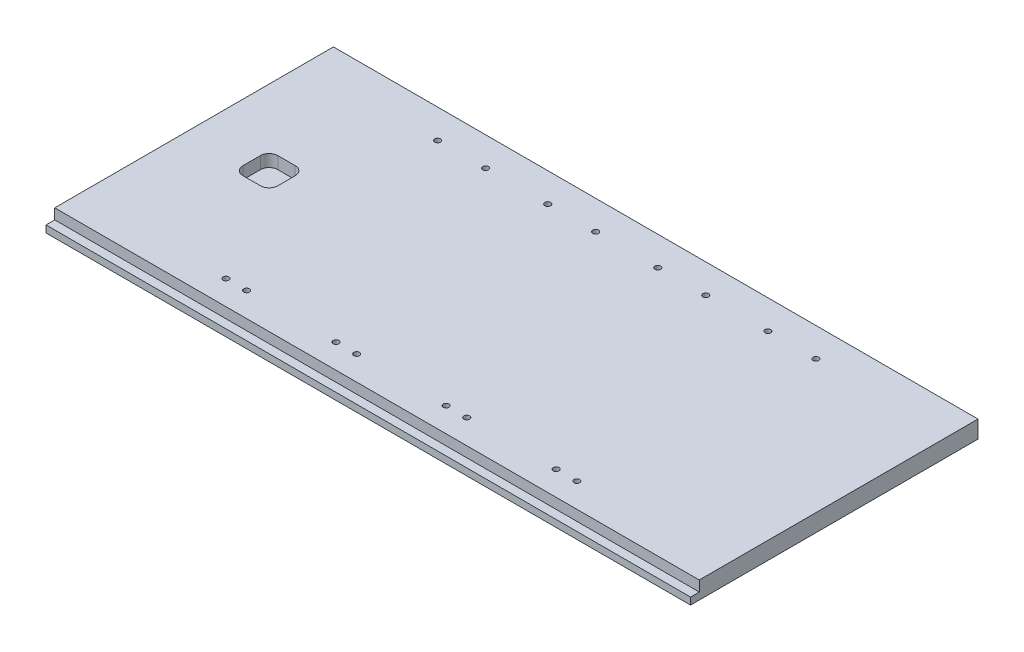
ISO-10303-21;
HEADER;
FILE_DESCRIPTION(('STEP AP214'),'2;1');
FILE_NAME('part.step','',(''),(''),'','','');
FILE_SCHEMA(('AUTOMOTIVE_DESIGN { 1 0 10303 214 1 1 1 1 }'));
ENDSEC;
DATA;
#1=APPLICATION_CONTEXT('core data for automotive mechanical design processes');
#2=APPLICATION_PROTOCOL_DEFINITION('international standard','automotive_design',2000,#1);
#3=PRODUCT_CONTEXT('',#1,'mechanical');
#4=PRODUCT('Part','Part','',(#3));
#5=PRODUCT_RELATED_PRODUCT_CATEGORY('part','',(#4));
#6=PRODUCT_DEFINITION_FORMATION('','',#4);
#7=PRODUCT_DEFINITION_CONTEXT('part definition',#1,'design');
#8=PRODUCT_DEFINITION('design','',#6,#7);
#9=PRODUCT_DEFINITION_SHAPE('','',#8);
#10=(LENGTH_UNIT() NAMED_UNIT(*) SI_UNIT(.MILLI.,.METRE.));
#11=(NAMED_UNIT(*) PLANE_ANGLE_UNIT() SI_UNIT($,.RADIAN.));
#12=(NAMED_UNIT(*) SI_UNIT($,.STERADIAN.) SOLID_ANGLE_UNIT());
#13=UNCERTAINTY_MEASURE_WITH_UNIT(LENGTH_MEASURE(1.E-05),#10,'distance_accuracy_value','');
#14=(GEOMETRIC_REPRESENTATION_CONTEXT(3) GLOBAL_UNCERTAINTY_ASSIGNED_CONTEXT((#13)) GLOBAL_UNIT_ASSIGNED_CONTEXT((#10,
#11,#12)) REPRESENTATION_CONTEXT('',''));
#15=CARTESIAN_POINT('',(0.,0.,0.));
#16=DIRECTION('',(0.,0.,1.));
#17=DIRECTION('',(1.,0.,0.));
#18=AXIS2_PLACEMENT_3D('',#15,#16,#17);
#19=CARTESIAN_POINT('',(-234.95,12.7,104.775));
#20=DIRECTION('',(1.,0.,0.));
#21=DIRECTION('',(0.,0.,-1.));
#22=AXIS2_PLACEMENT_3D('',#19,#20,#21);
#23=PLANE('',#22);
#24=DIRECTION('',(0.,-1.,0.));
#25=VECTOR('',#24,1.);
#26=CARTESIAN_POINT('',(-234.95,12.7,104.775));
#27=LINE('',#26,#25);
#28=CARTESIAN_POINT('',(-234.95,5.08,104.775));
#29=VERTEX_POINT('',#28);
#30=CARTESIAN_POINT('',(-234.95,0.,104.775));
#31=VERTEX_POINT('',#30);
#32=EDGE_CURVE('E210',#29,#31,#27,.T.);
#33=ORIENTED_EDGE('',*,*,#32,.F.);
#34=DIRECTION('',(0.,0.,1.));
#35=VECTOR('',#34,1.);
#36=CARTESIAN_POINT('',(-234.95,5.08,104.775));
#37=LINE('',#36,#35);
#38=CARTESIAN_POINT('',(-234.95,5.08,98.4250000000001));
#39=VERTEX_POINT('',#38);
#40=EDGE_CURVE('E158',#39,#29,#37,.T.);
#41=ORIENTED_EDGE('',*,*,#40,.F.);
#42=DIRECTION('',(0.,-1.,0.));
#43=VECTOR('',#42,1.);
#44=CARTESIAN_POINT('',(-234.95,12.7,98.4250000000001));
#45=LINE('',#44,#43);
#46=CARTESIAN_POINT('',(-234.95,12.7,98.4250000000001));
#47=VERTEX_POINT('',#46);
#48=EDGE_CURVE('E149',#47,#39,#45,.T.);
#49=ORIENTED_EDGE('',*,*,#48,.F.);
#50=DIRECTION('',(0.,0.,1.));
#51=VECTOR('',#50,1.);
#52=CARTESIAN_POINT('',(-234.95,12.7,104.775));
#53=LINE('',#52,#51);
#54=CARTESIAN_POINT('',(-234.95,12.7,-104.775));
#55=VERTEX_POINT('',#54);
#56=EDGE_CURVE('E164',#55,#47,#53,.T.);
#57=ORIENTED_EDGE('',*,*,#56,.F.);
#58=DIRECTION('',(0.,-1.,0.));
#59=VECTOR('',#58,1.);
#60=CARTESIAN_POINT('',(-234.95,12.7,-104.775));
#61=LINE('',#60,#59);
#62=CARTESIAN_POINT('',(-234.95,0.,-104.775));
#63=VERTEX_POINT('',#62);
#64=EDGE_CURVE('E189',#55,#63,#61,.T.);
#65=ORIENTED_EDGE('',*,*,#64,.T.);
#66=DIRECTION('',(0.,0.,1.));
#67=VECTOR('',#66,1.);
#68=CARTESIAN_POINT('',(-234.95,0.,104.775));
#69=LINE('',#68,#67);
#70=EDGE_CURVE('E190',#63,#31,#69,.T.);
#71=ORIENTED_EDGE('',*,*,#70,.T.);
#72=EDGE_LOOP('',(#33,#41,#49,#57,#65,#71));
#73=FACE_BOUND('',#72,.T.);
#74=ADVANCED_FACE('F45',(#73),#23,.F.);
#75=CARTESIAN_POINT('',(234.95,12.7,104.775));
#76=DIRECTION('',(0.,0.,-1.));
#77=DIRECTION('',(-1.,0.,0.));
#78=AXIS2_PLACEMENT_3D('',#75,#76,#77);
#79=PLANE('',#78);
#80=DIRECTION('',(0.,-1.,0.));
#81=VECTOR('',#80,1.);
#82=CARTESIAN_POINT('',(234.95,12.7,104.775));
#83=LINE('',#82,#81);
#84=CARTESIAN_POINT('',(234.95,5.08,104.775));
#85=VERTEX_POINT('',#84);
#86=CARTESIAN_POINT('',(234.95,0.,104.775));
#87=VERTEX_POINT('',#86);
#88=EDGE_CURVE('E207',#85,#87,#83,.T.);
#89=ORIENTED_EDGE('',*,*,#88,.F.);
#90=DIRECTION('',(-1.,0.,0.));
#91=VECTOR('',#90,1.);
#92=CARTESIAN_POINT('',(234.951,5.08,104.775));
#93=LINE('',#92,#91);
#94=EDGE_CURVE('E467',#85,#29,#93,.T.);
#95=ORIENTED_EDGE('',*,*,#94,.T.);
#96=ORIENTED_EDGE('',*,*,#32,.T.);
#97=DIRECTION('',(1.,0.,0.));
#98=VECTOR('',#97,1.);
#99=CARTESIAN_POINT('',(234.95,0.,104.775));
#100=LINE('',#99,#98);
#101=EDGE_CURVE('E194',#31,#87,#100,.T.);
#102=ORIENTED_EDGE('',*,*,#101,.T.);
#103=EDGE_LOOP('',(#89,#95,#96,#102));
#104=FACE_BOUND('',#103,.T.);
#105=ADVANCED_FACE('F415',(#104),#79,.F.);
#106=CARTESIAN_POINT('',(234.95,12.7,104.775));
#107=DIRECTION('',(-1.,0.,0.));
#108=DIRECTION('',(0.,0.,1.));
#109=AXIS2_PLACEMENT_3D('',#106,#107,#108);
#110=PLANE('',#109);
#111=DIRECTION('',(0.,1.,0.));
#112=VECTOR('',#111,1.);
#113=CARTESIAN_POINT('',(234.95,12.7,98.4250000000001));
#114=LINE('',#113,#112);
#115=CARTESIAN_POINT('',(234.95,5.08,98.4250000000001));
#116=VERTEX_POINT('',#115);
#117=CARTESIAN_POINT('',(234.95,12.7,98.4250000000001));
#118=VERTEX_POINT('',#117);
#119=EDGE_CURVE('E152',#116,#118,#114,.T.);
#120=ORIENTED_EDGE('',*,*,#119,.F.);
#121=DIRECTION('',(0.,0.,-1.));
#122=VECTOR('',#121,1.);
#123=CARTESIAN_POINT('',(234.95,5.08,104.775));
#124=LINE('',#123,#122);
#125=EDGE_CURVE('E166',#85,#116,#124,.T.);
#126=ORIENTED_EDGE('',*,*,#125,.F.);
#127=ORIENTED_EDGE('',*,*,#88,.T.);
#128=DIRECTION('',(0.,0.,-1.));
#129=VECTOR('',#128,1.);
#130=CARTESIAN_POINT('',(234.95,0.,104.775));
#131=LINE('',#130,#129);
#132=CARTESIAN_POINT('',(234.95,0.,-104.775));
#133=VERTEX_POINT('',#132);
#134=EDGE_CURVE('E181',#87,#133,#131,.T.);
#135=ORIENTED_EDGE('',*,*,#134,.T.);
#136=DIRECTION('',(0.,-1.,0.));
#137=VECTOR('',#136,1.);
#138=CARTESIAN_POINT('',(234.95,12.7,-104.775));
#139=LINE('',#138,#137);
#140=CARTESIAN_POINT('',(234.95,12.7,-104.775));
#141=VERTEX_POINT('',#140);
#142=EDGE_CURVE('E203',#141,#133,#139,.T.);
#143=ORIENTED_EDGE('',*,*,#142,.F.);
#144=DIRECTION('',(0.,0.,-1.));
#145=VECTOR('',#144,1.);
#146=CARTESIAN_POINT('',(234.95,12.7,104.775));
#147=LINE('',#146,#145);
#148=EDGE_CURVE('E173',#118,#141,#147,.T.);
#149=ORIENTED_EDGE('',*,*,#148,.F.);
#150=EDGE_LOOP('',(#120,#126,#127,#135,#143,#149));
#151=FACE_BOUND('',#150,.T.);
#152=ADVANCED_FACE('F419',(#151),#110,.F.);
#153=CARTESIAN_POINT('',(234.95,12.7,-104.775));
#154=DIRECTION('',(0.,0.,1.));
#155=DIRECTION('',(1.,0.,0.));
#156=AXIS2_PLACEMENT_3D('',#153,#154,#155);
#157=PLANE('',#156);
#158=DIRECTION('',(-1.,0.,0.));
#159=VECTOR('',#158,1.);
#160=CARTESIAN_POINT('',(234.95,0.,-104.775));
#161=LINE('',#160,#159);
#162=EDGE_CURVE('E174',#133,#63,#161,.T.);
#163=ORIENTED_EDGE('',*,*,#162,.T.);
#164=ORIENTED_EDGE('',*,*,#64,.F.);
#165=DIRECTION('',(-1.,0.,0.));
#166=VECTOR('',#165,1.);
#167=CARTESIAN_POINT('',(234.95,12.7,-104.775));
#168=LINE('',#167,#166);
#169=EDGE_CURVE('E170',#141,#55,#168,.T.);
#170=ORIENTED_EDGE('',*,*,#169,.F.);
#171=ORIENTED_EDGE('',*,*,#142,.T.);
#172=EDGE_LOOP('',(#163,#164,#170,#171));
#173=FACE_BOUND('',#172,.T.);
#174=ADVANCED_FACE('F388',(#173),#157,.F.);
#175=CARTESIAN_POINT('',(0.,12.7,0.));
#176=DIRECTION('',(0.,1.,0.));
#177=DIRECTION('',(0.,0.,1.));
#178=AXIS2_PLACEMENT_3D('',#175,#176,#177);
#179=PLANE('',#178);
#180=DIRECTION('',(-1.,0.,0.));
#181=VECTOR('',#180,1.);
#182=CARTESIAN_POINT('',(234.951,12.7,98.4250000000001));
#183=LINE('',#182,#181);
#184=EDGE_CURVE('E146',#118,#47,#183,.T.);
#185=ORIENTED_EDGE('',*,*,#184,.F.);
#186=ORIENTED_EDGE('',*,*,#148,.T.);
#187=ORIENTED_EDGE('',*,*,#169,.T.);
#188=ORIENTED_EDGE('',*,*,#56,.T.);
#189=EDGE_LOOP('',(#185,#186,#187,#188));
#190=FACE_BOUND('',#189,.T.);
#191=DIRECTION('',(0.,0.,-1.));
#192=VECTOR('',#191,1.);
#193=CARTESIAN_POINT('',(-167.55,12.7,-15.8749999999999));
#194=LINE('',#193,#192);
#195=CARTESIAN_POINT('',(-167.55,12.7,3.17500000000006));
#196=VERTEX_POINT('',#195);
#197=CARTESIAN_POINT('',(-167.55,12.7,-9.52499999999994));
#198=VERTEX_POINT('',#197);
#199=EDGE_CURVE('E462',#196,#198,#194,.T.);
#200=ORIENTED_EDGE('',*,*,#199,.F.);
#201=CARTESIAN_POINT('',(-173.9,12.7,3.17500000000006));
#202=DIRECTION('',(0.,1.,0.));
#203=DIRECTION('',(0.,0.,1.));
#204=AXIS2_PLACEMENT_3D('',#201,#202,#203);
#205=CIRCLE('',#204,6.35);
#206=CARTESIAN_POINT('',(-173.9,12.7,9.52500000000006));
#207=VERTEX_POINT('',#206);
#208=EDGE_CURVE('E252',#196,#207,#205,.F.);
#209=ORIENTED_EDGE('',*,*,#208,.T.);
#210=DIRECTION('',(1.,0.,0.));
#211=VECTOR('',#210,1.);
#212=CARTESIAN_POINT('',(-192.95,12.7,9.52500000000006));
#213=LINE('',#212,#211);
#214=CARTESIAN_POINT('',(-186.6,12.7,9.52500000000006));
#215=VERTEX_POINT('',#214);
#216=EDGE_CURVE('E473',#215,#207,#213,.T.);
#217=ORIENTED_EDGE('',*,*,#216,.F.);
#218=CARTESIAN_POINT('',(-186.6,12.7,3.17500000000006));
#219=DIRECTION('',(0.,1.,0.));
#220=DIRECTION('',(0.,0.,1.));
#221=AXIS2_PLACEMENT_3D('',#218,#219,#220);
#222=CIRCLE('',#221,6.35);
#223=CARTESIAN_POINT('',(-192.95,12.7,3.17500000000006));
#224=VERTEX_POINT('',#223);
#225=EDGE_CURVE('E255',#215,#224,#222,.F.);
#226=ORIENTED_EDGE('',*,*,#225,.T.);
#227=DIRECTION('',(0.,0.,1.));
#228=VECTOR('',#227,1.);
#229=CARTESIAN_POINT('',(-192.95,12.7,-15.8749999999999));
#230=LINE('',#229,#228);
#231=CARTESIAN_POINT('',(-192.95,12.7,-9.52499999999994));
#232=VERTEX_POINT('',#231);
#233=EDGE_CURVE('E470',#232,#224,#230,.T.);
#234=ORIENTED_EDGE('',*,*,#233,.F.);
#235=CARTESIAN_POINT('',(-186.6,12.7,-9.52499999999994));
#236=DIRECTION('',(0.,1.,0.));
#237=DIRECTION('',(0.,0.,1.));
#238=AXIS2_PLACEMENT_3D('',#235,#236,#237);
#239=CIRCLE('',#238,6.35);
#240=CARTESIAN_POINT('',(-186.6,12.7,-15.8749999999999));
#241=VERTEX_POINT('',#240);
#242=EDGE_CURVE('E54',#232,#241,#239,.F.);
#243=ORIENTED_EDGE('',*,*,#242,.T.);
#244=DIRECTION('',(-1.,0.,0.));
#245=VECTOR('',#244,1.);
#246=CARTESIAN_POINT('',(-192.95,12.7,-15.8749999999999));
#247=LINE('',#246,#245);
#248=CARTESIAN_POINT('',(-173.9,12.7,-15.8749999999999));
#249=VERTEX_POINT('',#248);
#250=EDGE_CURVE('E466',#249,#241,#247,.T.);
#251=ORIENTED_EDGE('',*,*,#250,.F.);
#252=CARTESIAN_POINT('',(-173.9,12.7,-9.52499999999994));
#253=DIRECTION('',(0.,1.,0.));
#254=DIRECTION('',(0.,0.,1.));
#255=AXIS2_PLACEMENT_3D('',#252,#253,#254);
#256=CIRCLE('',#255,6.35);
#257=EDGE_CURVE('E11',#249,#198,#256,.F.);
#258=ORIENTED_EDGE('',*,*,#257,.T.);
#259=EDGE_LOOP('',(#200,#209,#217,#226,#234,#243,#251,#258));
#260=FACE_BOUND('',#259,.T.);
#261=CARTESIAN_POINT('',(-137.85,12.7,-83.65));
#262=DIRECTION('',(0.,1.,0.));
#263=DIRECTION('',(0.,0.,1.));
#264=AXIS2_PLACEMENT_3D('',#261,#262,#263);
#265=CIRCLE('',#264,2.09999999999999);
#266=CARTESIAN_POINT('',(-137.85,12.7,-81.55));
#267=VERTEX_POINT('',#266);
#268=EDGE_CURVE('E290',#267,#267,#265,.T.);
#269=ORIENTED_EDGE('',*,*,#268,.F.);
#270=EDGE_LOOP('',(#269));
#271=FACE_BOUND('',#270,.T.);
#272=CARTESIAN_POINT('',(127.9,12.7,80.65));
#273=DIRECTION('',(0.,1.,0.));
#274=DIRECTION('',(0.,0.,1.));
#275=AXIS2_PLACEMENT_3D('',#272,#273,#274);
#276=CIRCLE('',#275,2.09999999999999);
#277=CARTESIAN_POINT('',(127.9,12.7,82.75));
#278=VERTEX_POINT('',#277);
#279=EDGE_CURVE('E486',#278,#278,#276,.T.);
#280=ORIENTED_EDGE('',*,*,#279,.F.);
#281=EDGE_LOOP('',(#280));
#282=FACE_BOUND('',#281,.T.);
#283=CARTESIAN_POINT('',(47.65,12.7,80.65));
#284=DIRECTION('',(0.,1.,0.));
#285=DIRECTION('',(0.,0.,1.));
#286=AXIS2_PLACEMENT_3D('',#283,#284,#285);
#287=CIRCLE('',#286,2.1);
#288=CARTESIAN_POINT('',(47.65,12.7,82.75));
#289=VERTEX_POINT('',#288);
#290=EDGE_CURVE('E304',#289,#289,#287,.T.);
#291=ORIENTED_EDGE('',*,*,#290,.F.);
#292=EDGE_LOOP('',(#291));
#293=FACE_BOUND('',#292,.T.);
#294=CARTESIAN_POINT('',(-32.6,12.7,80.65));
#295=DIRECTION('',(0.,1.,0.));
#296=DIRECTION('',(0.,0.,1.));
#297=AXIS2_PLACEMENT_3D('',#294,#295,#296);
#298=CIRCLE('',#297,2.1);
#299=CARTESIAN_POINT('',(-32.6,12.7,82.75));
#300=VERTEX_POINT('',#299);
#301=EDGE_CURVE('E273',#300,#300,#298,.T.);
#302=ORIENTED_EDGE('',*,*,#301,.F.);
#303=EDGE_LOOP('',(#302));
#304=FACE_BOUND('',#303,.T.);
#305=CARTESIAN_POINT('',(-57.6,12.7,-83.65));
#306=DIRECTION('',(0.,1.,0.));
#307=DIRECTION('',(0.,0.,1.));
#308=AXIS2_PLACEMENT_3D('',#305,#306,#307);
#309=CIRCLE('',#308,2.1);
#310=CARTESIAN_POINT('',(-57.6,12.7,-81.55));
#311=VERTEX_POINT('',#310);
#312=EDGE_CURVE('E293',#311,#311,#309,.T.);
#313=ORIENTED_EDGE('',*,*,#312,.F.);
#314=EDGE_LOOP('',(#313));
#315=FACE_BOUND('',#314,.T.);
#316=CARTESIAN_POINT('',(22.65,12.7,-83.65));
#317=DIRECTION('',(0.,1.,0.));
#318=DIRECTION('',(0.,0.,1.));
#319=AXIS2_PLACEMENT_3D('',#316,#317,#318);
#320=CIRCLE('',#319,2.1);
#321=CARTESIAN_POINT('',(22.65,12.7,-81.55));
#322=VERTEX_POINT('',#321);
#323=EDGE_CURVE('E287',#322,#322,#320,.T.);
#324=ORIENTED_EDGE('',*,*,#323,.F.);
#325=EDGE_LOOP('',(#324));
#326=FACE_BOUND('',#325,.T.);
#327=CARTESIAN_POINT('',(102.9,12.7,-83.65));
#328=DIRECTION('',(0.,1.,0.));
#329=DIRECTION('',(0.,0.,1.));
#330=AXIS2_PLACEMENT_3D('',#327,#328,#329);
#331=CIRCLE('',#330,2.1);
#332=CARTESIAN_POINT('',(102.9,12.7,-81.55));
#333=VERTEX_POINT('',#332);
#334=EDGE_CURVE('E288',#333,#333,#331,.T.);
#335=ORIENTED_EDGE('',*,*,#334,.F.);
#336=EDGE_LOOP('',(#335));
#337=FACE_BOUND('',#336,.T.);
#338=CARTESIAN_POINT('',(-112.85,12.7,80.65));
#339=DIRECTION('',(0.,1.,0.));
#340=DIRECTION('',(0.,0.,1.));
#341=AXIS2_PLACEMENT_3D('',#338,#339,#340);
#342=CIRCLE('',#341,2.1);
#343=CARTESIAN_POINT('',(-112.85,12.7,82.75));
#344=VERTEX_POINT('',#343);
#345=EDGE_CURVE('E312',#344,#344,#342,.T.);
#346=ORIENTED_EDGE('',*,*,#345,.F.);
#347=EDGE_LOOP('',(#346));
#348=FACE_BOUND('',#347,.T.);
#349=CARTESIAN_POINT('',(-127.9,12.7,80.65));
#350=DIRECTION('',(0.,1.,0.));
#351=DIRECTION('',(0.,0.,1.));
#352=AXIS2_PLACEMENT_3D('',#349,#350,#351);
#353=CIRCLE('',#352,2.09999999999999);
#354=CARTESIAN_POINT('',(-127.9,12.7,82.75));
#355=VERTEX_POINT('',#354);
#356=EDGE_CURVE('E300',#355,#355,#353,.T.);
#357=ORIENTED_EDGE('',*,*,#356,.F.);
#358=EDGE_LOOP('',(#357));
#359=FACE_BOUND('',#358,.T.);
#360=CARTESIAN_POINT('',(137.85,12.7,-83.65));
#361=DIRECTION('',(0.,1.,0.));
#362=DIRECTION('',(0.,0.,1.));
#363=AXIS2_PLACEMENT_3D('',#360,#361,#362);
#364=CIRCLE('',#363,2.09999999999999);
#365=CARTESIAN_POINT('',(137.85,12.7,-81.55));
#366=VERTEX_POINT('',#365);
#367=EDGE_CURVE('E299',#366,#366,#364,.T.);
#368=ORIENTED_EDGE('',*,*,#367,.F.);
#369=EDGE_LOOP('',(#368));
#370=FACE_BOUND('',#369,.T.);
#371=CARTESIAN_POINT('',(57.6,12.7,-83.65));
#372=DIRECTION('',(0.,1.,0.));
#373=DIRECTION('',(0.,0.,1.));
#374=AXIS2_PLACEMENT_3D('',#371,#372,#373);
#375=CIRCLE('',#374,2.1);
#376=CARTESIAN_POINT('',(57.6,12.7,-81.55));
#377=VERTEX_POINT('',#376);
#378=EDGE_CURVE('E366',#377,#377,#375,.T.);
#379=ORIENTED_EDGE('',*,*,#378,.F.);
#380=EDGE_LOOP('',(#379));
#381=FACE_BOUND('',#380,.T.);
#382=CARTESIAN_POINT('',(-22.65,12.7,-83.65));
#383=DIRECTION('',(0.,1.,0.));
#384=DIRECTION('',(0.,0.,1.));
#385=AXIS2_PLACEMENT_3D('',#382,#383,#384);
#386=CIRCLE('',#385,2.1);
#387=CARTESIAN_POINT('',(-22.65,12.7,-81.55));
#388=VERTEX_POINT('',#387);
#389=EDGE_CURVE('E268',#388,#388,#386,.T.);
#390=ORIENTED_EDGE('',*,*,#389,.F.);
#391=EDGE_LOOP('',(#390));
#392=FACE_BOUND('',#391,.T.);
#393=CARTESIAN_POINT('',(-47.65,12.7,80.65));
#394=DIRECTION('',(0.,1.,0.));
#395=DIRECTION('',(0.,0.,1.));
#396=AXIS2_PLACEMENT_3D('',#393,#394,#395);
#397=CIRCLE('',#396,2.1);
#398=CARTESIAN_POINT('',(-47.65,12.7,82.75));
#399=VERTEX_POINT('',#398);
#400=EDGE_CURVE('E334',#399,#399,#397,.T.);
#401=ORIENTED_EDGE('',*,*,#400,.F.);
#402=EDGE_LOOP('',(#401));
#403=FACE_BOUND('',#402,.T.);
#404=CARTESIAN_POINT('',(32.6,12.7,80.65));
#405=DIRECTION('',(0.,1.,0.));
#406=DIRECTION('',(0.,0.,1.));
#407=AXIS2_PLACEMENT_3D('',#404,#405,#406);
#408=CIRCLE('',#407,2.1);
#409=CARTESIAN_POINT('',(32.6,12.7,82.75));
#410=VERTEX_POINT('',#409);
#411=EDGE_CURVE('E265',#410,#410,#408,.T.);
#412=ORIENTED_EDGE('',*,*,#411,.F.);
#413=EDGE_LOOP('',(#412));
#414=FACE_BOUND('',#413,.T.);
#415=CARTESIAN_POINT('',(112.85,12.7,80.65));
#416=DIRECTION('',(0.,1.,0.));
#417=DIRECTION('',(0.,0.,1.));
#418=AXIS2_PLACEMENT_3D('',#415,#416,#417);
#419=CIRCLE('',#418,2.1);
#420=CARTESIAN_POINT('',(112.85,12.7,82.75));
#421=VERTEX_POINT('',#420);
#422=EDGE_CURVE('E266',#421,#421,#419,.T.);
#423=ORIENTED_EDGE('',*,*,#422,.F.);
#424=EDGE_LOOP('',(#423));
#425=FACE_BOUND('',#424,.T.);
#426=CARTESIAN_POINT('',(-102.9,12.7,-83.65));
#427=DIRECTION('',(0.,1.,0.));
#428=DIRECTION('',(0.,0.,1.));
#429=AXIS2_PLACEMENT_3D('',#426,#427,#428);
#430=CIRCLE('',#429,2.1);
#431=CARTESIAN_POINT('',(-102.9,12.7,-81.55));
#432=VERTEX_POINT('',#431);
#433=EDGE_CURVE('E184',#432,#432,#430,.T.);
#434=ORIENTED_EDGE('',*,*,#433,.F.);
#435=EDGE_LOOP('',(#434));
#436=FACE_BOUND('',#435,.T.);
#437=ADVANCED_FACE('F168',(#190,#260,#271,#282,#293,#304,#315,#326,#337,#348,#359,#370,#381,
#392,#403,#414,#425,#436),#179,.T.);
#438=CARTESIAN_POINT('',(0.,0.,0.));
#439=DIRECTION('',(0.,1.,0.));
#440=DIRECTION('',(0.,0.,1.));
#441=AXIS2_PLACEMENT_3D('',#438,#439,#440);
#442=PLANE('',#441);
#443=CARTESIAN_POINT('',(-137.85,0.,-83.65));
#444=DIRECTION('',(0.,1.,0.));
#445=DIRECTION('',(0.,0.,1.));
#446=AXIS2_PLACEMENT_3D('',#443,#444,#445);
#447=CIRCLE('',#446,2.09999999999999);
#448=CARTESIAN_POINT('',(-137.85,0.,-81.55));
#449=VERTEX_POINT('',#448);
#450=EDGE_CURVE('E292',#449,#449,#447,.T.);
#451=ORIENTED_EDGE('',*,*,#450,.T.);
#452=EDGE_LOOP('',(#451));
#453=FACE_BOUND('',#452,.T.);
#454=CARTESIAN_POINT('',(127.9,0.,80.65));
#455=DIRECTION('',(0.,1.,0.));
#456=DIRECTION('',(0.,0.,1.));
#457=AXIS2_PLACEMENT_3D('',#454,#455,#456);
#458=CIRCLE('',#457,2.09999999999999);
#459=CARTESIAN_POINT('',(127.9,0.,82.75));
#460=VERTEX_POINT('',#459);
#461=EDGE_CURVE('E315',#460,#460,#458,.T.);
#462=ORIENTED_EDGE('',*,*,#461,.T.);
#463=EDGE_LOOP('',(#462));
#464=FACE_BOUND('',#463,.T.);
#465=CARTESIAN_POINT('',(47.65,0.,80.65));
#466=DIRECTION('',(0.,1.,0.));
#467=DIRECTION('',(0.,0.,1.));
#468=AXIS2_PLACEMENT_3D('',#465,#466,#467);
#469=CIRCLE('',#468,2.1);
#470=CARTESIAN_POINT('',(47.65,0.,82.75));
#471=VERTEX_POINT('',#470);
#472=EDGE_CURVE('E483',#471,#471,#469,.T.);
#473=ORIENTED_EDGE('',*,*,#472,.T.);
#474=EDGE_LOOP('',(#473));
#475=FACE_BOUND('',#474,.T.);
#476=CARTESIAN_POINT('',(-32.6,0.,80.65));
#477=DIRECTION('',(0.,1.,0.));
#478=DIRECTION('',(0.,0.,1.));
#479=AXIS2_PLACEMENT_3D('',#476,#477,#478);
#480=CIRCLE('',#479,2.1);
#481=CARTESIAN_POINT('',(-32.6,0.,82.75));
#482=VERTEX_POINT('',#481);
#483=EDGE_CURVE('E276',#482,#482,#480,.T.);
#484=ORIENTED_EDGE('',*,*,#483,.T.);
#485=EDGE_LOOP('',(#484));
#486=FACE_BOUND('',#485,.T.);
#487=CARTESIAN_POINT('',(-57.6,0.,-83.65));
#488=DIRECTION('',(0.,1.,0.));
#489=DIRECTION('',(0.,0.,1.));
#490=AXIS2_PLACEMENT_3D('',#487,#488,#489);
#491=CIRCLE('',#490,2.1);
#492=CARTESIAN_POINT('',(-57.6,0.,-81.55));
#493=VERTEX_POINT('',#492);
#494=EDGE_CURVE('E327',#493,#493,#491,.T.);
#495=ORIENTED_EDGE('',*,*,#494,.T.);
#496=EDGE_LOOP('',(#495));
#497=FACE_BOUND('',#496,.T.);
#498=CARTESIAN_POINT('',(22.65,0.,-83.65));
#499=DIRECTION('',(0.,1.,0.));
#500=DIRECTION('',(0.,0.,1.));
#501=AXIS2_PLACEMENT_3D('',#498,#499,#500);
#502=CIRCLE('',#501,2.1);
#503=CARTESIAN_POINT('',(22.65,0.,-81.55));
#504=VERTEX_POINT('',#503);
#505=EDGE_CURVE('E284',#504,#504,#502,.T.);
#506=ORIENTED_EDGE('',*,*,#505,.T.);
#507=EDGE_LOOP('',(#506));
#508=FACE_BOUND('',#507,.T.);
#509=CARTESIAN_POINT('',(102.9,0.,-83.65));
#510=DIRECTION('',(0.,1.,0.));
#511=DIRECTION('',(0.,0.,1.));
#512=AXIS2_PLACEMENT_3D('',#509,#510,#511);
#513=CIRCLE('',#512,2.1);
#514=CARTESIAN_POINT('',(102.9,0.,-81.55));
#515=VERTEX_POINT('',#514);
#516=EDGE_CURVE('E260',#515,#515,#513,.T.);
#517=ORIENTED_EDGE('',*,*,#516,.T.);
#518=EDGE_LOOP('',(#517));
#519=FACE_BOUND('',#518,.T.);
#520=CARTESIAN_POINT('',(-112.85,0.,80.65));
#521=DIRECTION('',(0.,1.,0.));
#522=DIRECTION('',(0.,0.,1.));
#523=AXIS2_PLACEMENT_3D('',#520,#521,#522);
#524=CIRCLE('',#523,2.1);
#525=CARTESIAN_POINT('',(-112.85,0.,82.75));
#526=VERTEX_POINT('',#525);
#527=EDGE_CURVE('E275',#526,#526,#524,.T.);
#528=ORIENTED_EDGE('',*,*,#527,.T.);
#529=EDGE_LOOP('',(#528));
#530=FACE_BOUND('',#529,.T.);
#531=CARTESIAN_POINT('',(-127.9,0.,80.65));
#532=DIRECTION('',(0.,1.,0.));
#533=DIRECTION('',(0.,0.,1.));
#534=AXIS2_PLACEMENT_3D('',#531,#532,#533);
#535=CIRCLE('',#534,2.09999999999999);
#536=CARTESIAN_POINT('',(-127.9,0.,82.75));
#537=VERTEX_POINT('',#536);
#538=EDGE_CURVE('E338',#537,#537,#535,.T.);
#539=ORIENTED_EDGE('',*,*,#538,.T.);
#540=EDGE_LOOP('',(#539));
#541=FACE_BOUND('',#540,.T.);
#542=CARTESIAN_POINT('',(137.85,0.,-83.65));
#543=DIRECTION('',(0.,1.,0.));
#544=DIRECTION('',(0.,0.,1.));
#545=AXIS2_PLACEMENT_3D('',#542,#543,#544);
#546=CIRCLE('',#545,2.09999999999999);
#547=CARTESIAN_POINT('',(137.85,0.,-81.55));
#548=VERTEX_POINT('',#547);
#549=EDGE_CURVE('E296',#548,#548,#546,.T.);
#550=ORIENTED_EDGE('',*,*,#549,.T.);
#551=EDGE_LOOP('',(#550));
#552=FACE_BOUND('',#551,.T.);
#553=CARTESIAN_POINT('',(57.6,0.,-83.65));
#554=DIRECTION('',(0.,1.,0.));
#555=DIRECTION('',(0.,0.,1.));
#556=AXIS2_PLACEMENT_3D('',#553,#554,#555);
#557=CIRCLE('',#556,2.1);
#558=CARTESIAN_POINT('',(57.6,0.,-81.55));
#559=VERTEX_POINT('',#558);
#560=EDGE_CURVE('E355',#559,#559,#557,.T.);
#561=ORIENTED_EDGE('',*,*,#560,.T.);
#562=EDGE_LOOP('',(#561));
#563=FACE_BOUND('',#562,.T.);
#564=CARTESIAN_POINT('',(-22.65,0.,-83.65));
#565=DIRECTION('',(0.,1.,0.));
#566=DIRECTION('',(0.,0.,1.));
#567=AXIS2_PLACEMENT_3D('',#564,#565,#566);
#568=CIRCLE('',#567,2.1);
#569=CARTESIAN_POINT('',(-22.65,0.,-81.55));
#570=VERTEX_POINT('',#569);
#571=EDGE_CURVE('E271',#570,#570,#568,.T.);
#572=ORIENTED_EDGE('',*,*,#571,.T.);
#573=EDGE_LOOP('',(#572));
#574=FACE_BOUND('',#573,.T.);
#575=CARTESIAN_POINT('',(-47.65,0.,80.65));
#576=DIRECTION('',(0.,1.,0.));
#577=DIRECTION('',(0.,0.,1.));
#578=AXIS2_PLACEMENT_3D('',#575,#576,#577);
#579=CIRCLE('',#578,2.1);
#580=CARTESIAN_POINT('',(-47.65,0.,82.75));
#581=VERTEX_POINT('',#580);
#582=EDGE_CURVE('E339',#581,#581,#579,.T.);
#583=ORIENTED_EDGE('',*,*,#582,.T.);
#584=EDGE_LOOP('',(#583));
#585=FACE_BOUND('',#584,.T.);
#586=CARTESIAN_POINT('',(32.6,0.,80.65));
#587=DIRECTION('',(0.,1.,0.));
#588=DIRECTION('',(0.,0.,1.));
#589=AXIS2_PLACEMENT_3D('',#586,#587,#588);
#590=CIRCLE('',#589,2.1);
#591=CARTESIAN_POINT('',(32.6,0.,82.75));
#592=VERTEX_POINT('',#591);
#593=EDGE_CURVE('E262',#592,#592,#590,.T.);
#594=ORIENTED_EDGE('',*,*,#593,.T.);
#595=EDGE_LOOP('',(#594));
#596=FACE_BOUND('',#595,.T.);
#597=CARTESIAN_POINT('',(112.85,0.,80.65));
#598=DIRECTION('',(0.,1.,0.));
#599=DIRECTION('',(0.,0.,1.));
#600=AXIS2_PLACEMENT_3D('',#597,#598,#599);
#601=CIRCLE('',#600,2.1);
#602=CARTESIAN_POINT('',(112.85,0.,82.75));
#603=VERTEX_POINT('',#602);
#604=EDGE_CURVE('E349',#603,#603,#601,.T.);
#605=ORIENTED_EDGE('',*,*,#604,.T.);
#606=EDGE_LOOP('',(#605));
#607=FACE_BOUND('',#606,.T.);
#608=CARTESIAN_POINT('',(-102.9,0.,-83.65));
#609=DIRECTION('',(0.,1.,0.));
#610=DIRECTION('',(0.,0.,1.));
#611=AXIS2_PLACEMENT_3D('',#608,#609,#610);
#612=CIRCLE('',#611,2.1);
#613=CARTESIAN_POINT('',(-102.9,0.,-81.55));
#614=VERTEX_POINT('',#613);
#615=EDGE_CURVE('E195',#614,#614,#612,.T.);
#616=ORIENTED_EDGE('',*,*,#615,.T.);
#617=EDGE_LOOP('',(#616));
#618=FACE_BOUND('',#617,.T.);
#619=ORIENTED_EDGE('',*,*,#70,.F.);
#620=ORIENTED_EDGE('',*,*,#162,.F.);
#621=ORIENTED_EDGE('',*,*,#134,.F.);
#622=ORIENTED_EDGE('',*,*,#101,.F.);
#623=EDGE_LOOP('',(#619,#620,#621,#622));
#624=FACE_BOUND('',#623,.T.);
#625=ADVANCED_FACE('F375',(#453,#464,#475,#486,#497,#508,#519,#530,#541,#552,#563,#574,#585,
#596,#607,#618,#624),#442,.F.);
#626=CARTESIAN_POINT('',(-102.9,0.,-83.65));
#627=DIRECTION('',(0.,1.,0.));
#628=DIRECTION('',(0.,0.,1.));
#629=AXIS2_PLACEMENT_3D('',#626,#627,#628);
#630=CYLINDRICAL_SURFACE('',#629,2.1);
#631=ORIENTED_EDGE('',*,*,#615,.F.);
#632=EDGE_LOOP('',(#631));
#633=FACE_BOUND('',#632,.T.);
#634=ORIENTED_EDGE('',*,*,#433,.T.);
#635=EDGE_LOOP('',(#634));
#636=FACE_BOUND('',#635,.T.);
#637=ADVANCED_FACE('F400',(#633,#636),#630,.F.);
#638=CARTESIAN_POINT('',(112.85,0.,80.65));
#639=DIRECTION('',(0.,1.,0.));
#640=DIRECTION('',(0.,0.,1.));
#641=AXIS2_PLACEMENT_3D('',#638,#639,#640);
#642=CYLINDRICAL_SURFACE('',#641,2.1);
#643=ORIENTED_EDGE('',*,*,#604,.F.);
#644=EDGE_LOOP('',(#643));
#645=FACE_BOUND('',#644,.T.);
#646=ORIENTED_EDGE('',*,*,#422,.T.);
#647=EDGE_LOOP('',(#646));
#648=FACE_BOUND('',#647,.T.);
#649=ADVANCED_FACE('F402',(#645,#648),#642,.F.);
#650=CARTESIAN_POINT('',(32.6,0.,80.65));
#651=DIRECTION('',(0.,1.,0.));
#652=DIRECTION('',(0.,0.,1.));
#653=AXIS2_PLACEMENT_3D('',#650,#651,#652);
#654=CYLINDRICAL_SURFACE('',#653,2.1);
#655=ORIENTED_EDGE('',*,*,#593,.F.);
#656=EDGE_LOOP('',(#655));
#657=FACE_BOUND('',#656,.T.);
#658=ORIENTED_EDGE('',*,*,#411,.T.);
#659=EDGE_LOOP('',(#658));
#660=FACE_BOUND('',#659,.T.);
#661=ADVANCED_FACE('F408',(#657,#660),#654,.F.);
#662=CARTESIAN_POINT('',(-47.65,0.,80.65));
#663=DIRECTION('',(0.,1.,0.));
#664=DIRECTION('',(0.,0.,1.));
#665=AXIS2_PLACEMENT_3D('',#662,#663,#664);
#666=CYLINDRICAL_SURFACE('',#665,2.1);
#667=ORIENTED_EDGE('',*,*,#582,.F.);
#668=EDGE_LOOP('',(#667));
#669=FACE_BOUND('',#668,.T.);
#670=ORIENTED_EDGE('',*,*,#400,.T.);
#671=EDGE_LOOP('',(#670));
#672=FACE_BOUND('',#671,.T.);
#673=ADVANCED_FACE('F530',(#669,#672),#666,.F.);
#674=CARTESIAN_POINT('',(-22.65,0.,-83.65));
#675=DIRECTION('',(0.,1.,0.));
#676=DIRECTION('',(0.,0.,1.));
#677=AXIS2_PLACEMENT_3D('',#674,#675,#676);
#678=CYLINDRICAL_SURFACE('',#677,2.1);
#679=ORIENTED_EDGE('',*,*,#571,.F.);
#680=EDGE_LOOP('',(#679));
#681=FACE_BOUND('',#680,.T.);
#682=ORIENTED_EDGE('',*,*,#389,.T.);
#683=EDGE_LOOP('',(#682));
#684=FACE_BOUND('',#683,.T.);
#685=ADVANCED_FACE('F382',(#681,#684),#678,.F.);
#686=CARTESIAN_POINT('',(57.6,0.,-83.65));
#687=DIRECTION('',(0.,1.,0.));
#688=DIRECTION('',(0.,0.,1.));
#689=AXIS2_PLACEMENT_3D('',#686,#687,#688);
#690=CYLINDRICAL_SURFACE('',#689,2.1);
#691=ORIENTED_EDGE('',*,*,#560,.F.);
#692=EDGE_LOOP('',(#691));
#693=FACE_BOUND('',#692,.T.);
#694=ORIENTED_EDGE('',*,*,#378,.T.);
#695=EDGE_LOOP('',(#694));
#696=FACE_BOUND('',#695,.T.);
#697=ADVANCED_FACE('F378',(#693,#696),#690,.F.);
#698=CARTESIAN_POINT('',(137.85,0.,-83.65));
#699=DIRECTION('',(0.,1.,0.));
#700=DIRECTION('',(0.,0.,1.));
#701=AXIS2_PLACEMENT_3D('',#698,#699,#700);
#702=CYLINDRICAL_SURFACE('',#701,2.09999999999999);
#703=ORIENTED_EDGE('',*,*,#549,.F.);
#704=EDGE_LOOP('',(#703));
#705=FACE_BOUND('',#704,.T.);
#706=ORIENTED_EDGE('',*,*,#367,.T.);
#707=EDGE_LOOP('',(#706));
#708=FACE_BOUND('',#707,.T.);
#709=ADVANCED_FACE('F381',(#705,#708),#702,.F.);
#710=CARTESIAN_POINT('',(-127.9,0.,80.65));
#711=DIRECTION('',(0.,1.,0.));
#712=DIRECTION('',(0.,0.,1.));
#713=AXIS2_PLACEMENT_3D('',#710,#711,#712);
#714=CYLINDRICAL_SURFACE('',#713,2.09999999999999);
#715=ORIENTED_EDGE('',*,*,#538,.F.);
#716=EDGE_LOOP('',(#715));
#717=FACE_BOUND('',#716,.T.);
#718=ORIENTED_EDGE('',*,*,#356,.T.);
#719=EDGE_LOOP('',(#718));
#720=FACE_BOUND('',#719,.T.);
#721=ADVANCED_FACE('F521',(#717,#720),#714,.F.);
#722=CARTESIAN_POINT('',(-112.85,0.,80.65));
#723=DIRECTION('',(0.,1.,0.));
#724=DIRECTION('',(0.,0.,1.));
#725=AXIS2_PLACEMENT_3D('',#722,#723,#724);
#726=CYLINDRICAL_SURFACE('',#725,2.1);
#727=ORIENTED_EDGE('',*,*,#527,.F.);
#728=EDGE_LOOP('',(#727));
#729=FACE_BOUND('',#728,.T.);
#730=ORIENTED_EDGE('',*,*,#345,.T.);
#731=EDGE_LOOP('',(#730));
#732=FACE_BOUND('',#731,.T.);
#733=ADVANCED_FACE('F517',(#729,#732),#726,.F.);
#734=CARTESIAN_POINT('',(102.9,0.,-83.65));
#735=DIRECTION('',(0.,1.,0.));
#736=DIRECTION('',(0.,0.,1.));
#737=AXIS2_PLACEMENT_3D('',#734,#735,#736);
#738=CYLINDRICAL_SURFACE('',#737,2.1);
#739=ORIENTED_EDGE('',*,*,#516,.F.);
#740=EDGE_LOOP('',(#739));
#741=FACE_BOUND('',#740,.T.);
#742=ORIENTED_EDGE('',*,*,#334,.T.);
#743=EDGE_LOOP('',(#742));
#744=FACE_BOUND('',#743,.T.);
#745=ADVANCED_FACE('F513',(#741,#744),#738,.F.);
#746=CARTESIAN_POINT('',(22.65,0.,-83.65));
#747=DIRECTION('',(0.,1.,0.));
#748=DIRECTION('',(0.,0.,1.));
#749=AXIS2_PLACEMENT_3D('',#746,#747,#748);
#750=CYLINDRICAL_SURFACE('',#749,2.1);
#751=ORIENTED_EDGE('',*,*,#505,.F.);
#752=EDGE_LOOP('',(#751));
#753=FACE_BOUND('',#752,.T.);
#754=ORIENTED_EDGE('',*,*,#323,.T.);
#755=EDGE_LOOP('',(#754));
#756=FACE_BOUND('',#755,.T.);
#757=ADVANCED_FACE('F516',(#753,#756),#750,.F.);
#758=CARTESIAN_POINT('',(-57.6,0.,-83.65));
#759=DIRECTION('',(0.,1.,0.));
#760=DIRECTION('',(0.,0.,1.));
#761=AXIS2_PLACEMENT_3D('',#758,#759,#760);
#762=CYLINDRICAL_SURFACE('',#761,2.1);
#763=ORIENTED_EDGE('',*,*,#494,.F.);
#764=EDGE_LOOP('',(#763));
#765=FACE_BOUND('',#764,.T.);
#766=ORIENTED_EDGE('',*,*,#312,.T.);
#767=EDGE_LOOP('',(#766));
#768=FACE_BOUND('',#767,.T.);
#769=ADVANCED_FACE('F523',(#765,#768),#762,.F.);
#770=CARTESIAN_POINT('',(-32.6,0.,80.65));
#771=DIRECTION('',(0.,1.,0.));
#772=DIRECTION('',(0.,0.,1.));
#773=AXIS2_PLACEMENT_3D('',#770,#771,#772);
#774=CYLINDRICAL_SURFACE('',#773,2.1);
#775=ORIENTED_EDGE('',*,*,#483,.F.);
#776=EDGE_LOOP('',(#775));
#777=FACE_BOUND('',#776,.T.);
#778=ORIENTED_EDGE('',*,*,#301,.T.);
#779=EDGE_LOOP('',(#778));
#780=FACE_BOUND('',#779,.T.);
#781=ADVANCED_FACE('F508',(#777,#780),#774,.F.);
#782=CARTESIAN_POINT('',(47.65,0.,80.65));
#783=DIRECTION('',(0.,1.,0.));
#784=DIRECTION('',(0.,0.,1.));
#785=AXIS2_PLACEMENT_3D('',#782,#783,#784);
#786=CYLINDRICAL_SURFACE('',#785,2.1);
#787=ORIENTED_EDGE('',*,*,#472,.F.);
#788=EDGE_LOOP('',(#787));
#789=FACE_BOUND('',#788,.T.);
#790=ORIENTED_EDGE('',*,*,#290,.T.);
#791=EDGE_LOOP('',(#790));
#792=FACE_BOUND('',#791,.T.);
#793=ADVANCED_FACE('F500',(#789,#792),#786,.F.);
#794=CARTESIAN_POINT('',(127.9,0.,80.65));
#795=DIRECTION('',(0.,1.,0.));
#796=DIRECTION('',(0.,0.,1.));
#797=AXIS2_PLACEMENT_3D('',#794,#795,#796);
#798=CYLINDRICAL_SURFACE('',#797,2.09999999999999);
#799=ORIENTED_EDGE('',*,*,#461,.F.);
#800=EDGE_LOOP('',(#799));
#801=FACE_BOUND('',#800,.T.);
#802=ORIENTED_EDGE('',*,*,#279,.T.);
#803=EDGE_LOOP('',(#802));
#804=FACE_BOUND('',#803,.T.);
#805=ADVANCED_FACE('F497',(#801,#804),#798,.F.);
#806=CARTESIAN_POINT('',(-137.85,0.,-83.65));
#807=DIRECTION('',(0.,1.,0.));
#808=DIRECTION('',(0.,0.,1.));
#809=AXIS2_PLACEMENT_3D('',#806,#807,#808);
#810=CYLINDRICAL_SURFACE('',#809,2.09999999999999);
#811=ORIENTED_EDGE('',*,*,#450,.F.);
#812=EDGE_LOOP('',(#811));
#813=FACE_BOUND('',#812,.T.);
#814=ORIENTED_EDGE('',*,*,#268,.T.);
#815=EDGE_LOOP('',(#814));
#816=FACE_BOUND('',#815,.T.);
#817=ADVANCED_FACE('F499',(#813,#816),#810,.F.);
#818=CARTESIAN_POINT('',(-167.55,3.81,-15.8749999999999));
#819=DIRECTION('',(1.,0.,0.));
#820=DIRECTION('',(0.,0.,-1.));
#821=AXIS2_PLACEMENT_3D('',#818,#819,#820);
#822=PLANE('',#821);
#823=DIRECTION('',(0.,0.,-1.));
#824=VECTOR('',#823,1.);
#825=CARTESIAN_POINT('',(-167.55,3.81,-15.8749999999999));
#826=LINE('',#825,#824);
#827=CARTESIAN_POINT('',(-167.55,3.81,3.17500000000006));
#828=VERTEX_POINT('',#827);
#829=CARTESIAN_POINT('',(-167.55,3.81,-9.52499999999994));
#830=VERTEX_POINT('',#829);
#831=EDGE_CURVE('E458',#828,#830,#826,.T.);
#832=ORIENTED_EDGE('',*,*,#831,.F.);
#833=DIRECTION('',(0.,1.,0.));
#834=VECTOR('',#833,1.);
#835=CARTESIAN_POINT('',(-167.55,12.7,3.17500000000006));
#836=LINE('',#835,#834);
#837=EDGE_CURVE('E216',#828,#196,#836,.T.);
#838=ORIENTED_EDGE('',*,*,#837,.T.);
#839=ORIENTED_EDGE('',*,*,#199,.T.);
#840=DIRECTION('',(0.,1.,0.));
#841=VECTOR('',#840,1.);
#842=CARTESIAN_POINT('',(-167.55,3.81,-9.52499999999994));
#843=LINE('',#842,#841);
#844=EDGE_CURVE('E213',#198,#830,#843,.F.);
#845=ORIENTED_EDGE('',*,*,#844,.T.);
#846=EDGE_LOOP('',(#832,#838,#839,#845));
#847=FACE_BOUND('',#846,.T.);
#848=ADVANCED_FACE('F505',(#847),#822,.F.);
#849=CARTESIAN_POINT('',(-192.95,3.81,9.52500000000006));
#850=DIRECTION('',(0.,0.,1.));
#851=DIRECTION('',(1.,0.,0.));
#852=AXIS2_PLACEMENT_3D('',#849,#850,#851);
#853=PLANE('',#852);
#854=ORIENTED_EDGE('',*,*,#216,.T.);
#855=DIRECTION('',(0.,1.,0.));
#856=VECTOR('',#855,1.);
#857=CARTESIAN_POINT('',(-173.9,3.81,9.52500000000006));
#858=LINE('',#857,#856);
#859=CARTESIAN_POINT('',(-173.9,3.81,9.52500000000006));
#860=VERTEX_POINT('',#859);
#861=EDGE_CURVE('E224',#207,#860,#858,.F.);
#862=ORIENTED_EDGE('',*,*,#861,.T.);
#863=DIRECTION('',(1.,0.,0.));
#864=VECTOR('',#863,1.);
#865=CARTESIAN_POINT('',(-192.95,3.81,9.52500000000006));
#866=LINE('',#865,#864);
#867=CARTESIAN_POINT('',(-186.6,3.81,9.52500000000006));
#868=VERTEX_POINT('',#867);
#869=EDGE_CURVE('E454',#868,#860,#866,.T.);
#870=ORIENTED_EDGE('',*,*,#869,.F.);
#871=DIRECTION('',(0.,1.,0.));
#872=VECTOR('',#871,1.);
#873=CARTESIAN_POINT('',(-186.6,12.7,9.52500000000006));
#874=LINE('',#873,#872);
#875=EDGE_CURVE('E220',#868,#215,#874,.T.);
#876=ORIENTED_EDGE('',*,*,#875,.T.);
#877=EDGE_LOOP('',(#854,#862,#870,#876));
#878=FACE_BOUND('',#877,.T.);
#879=ADVANCED_FACE('F584',(#878),#853,.F.);
#880=CARTESIAN_POINT('',(-192.95,3.81,-15.8749999999999));
#881=DIRECTION('',(-1.,0.,0.));
#882=DIRECTION('',(0.,0.,1.));
#883=AXIS2_PLACEMENT_3D('',#880,#881,#882);
#884=PLANE('',#883);
#885=ORIENTED_EDGE('',*,*,#233,.T.);
#886=DIRECTION('',(0.,1.,0.));
#887=VECTOR('',#886,1.);
#888=CARTESIAN_POINT('',(-192.95,3.81,3.17500000000006));
#889=LINE('',#888,#887);
#890=CARTESIAN_POINT('',(-192.95,3.81,3.17500000000006));
#891=VERTEX_POINT('',#890);
#892=EDGE_CURVE('E243',#224,#891,#889,.F.);
#893=ORIENTED_EDGE('',*,*,#892,.T.);
#894=DIRECTION('',(0.,0.,1.));
#895=VECTOR('',#894,1.);
#896=CARTESIAN_POINT('',(-192.95,3.81,-15.8749999999999));
#897=LINE('',#896,#895);
#898=CARTESIAN_POINT('',(-192.95,3.81,-9.52499999999994));
#899=VERTEX_POINT('',#898);
#900=EDGE_CURVE('E445',#899,#891,#897,.T.);
#901=ORIENTED_EDGE('',*,*,#900,.F.);
#902=DIRECTION('',(0.,1.,0.));
#903=VECTOR('',#902,1.);
#904=CARTESIAN_POINT('',(-192.95,12.7,-9.52499999999994));
#905=LINE('',#904,#903);
#906=EDGE_CURVE('E239',#899,#232,#905,.T.);
#907=ORIENTED_EDGE('',*,*,#906,.T.);
#908=EDGE_LOOP('',(#885,#893,#901,#907));
#909=FACE_BOUND('',#908,.T.);
#910=ADVANCED_FACE('F451',(#909),#884,.F.);
#911=CARTESIAN_POINT('',(-192.95,3.81,-15.8749999999999));
#912=DIRECTION('',(0.,0.,-1.));
#913=DIRECTION('',(-1.,0.,0.));
#914=AXIS2_PLACEMENT_3D('',#911,#912,#913);
#915=PLANE('',#914);
#916=ORIENTED_EDGE('',*,*,#250,.T.);
#917=DIRECTION('',(0.,1.,0.));
#918=VECTOR('',#917,1.);
#919=CARTESIAN_POINT('',(-186.6,3.81,-15.8749999999999));
#920=LINE('',#919,#918);
#921=CARTESIAN_POINT('',(-186.6,3.81,-15.8749999999999));
#922=VERTEX_POINT('',#921);
#923=EDGE_CURVE('E249',#241,#922,#920,.F.);
#924=ORIENTED_EDGE('',*,*,#923,.T.);
#925=DIRECTION('',(-1.,0.,0.));
#926=VECTOR('',#925,1.);
#927=CARTESIAN_POINT('',(-192.95,3.81,-15.8749999999999));
#928=LINE('',#927,#926);
#929=CARTESIAN_POINT('',(-173.9,3.81,-15.8749999999999));
#930=VERTEX_POINT('',#929);
#931=EDGE_CURVE('E448',#930,#922,#928,.T.);
#932=ORIENTED_EDGE('',*,*,#931,.F.);
#933=DIRECTION('',(0.,1.,0.));
#934=VECTOR('',#933,1.);
#935=CARTESIAN_POINT('',(-173.9,12.7,-15.8749999999999));
#936=LINE('',#935,#934);
#937=EDGE_CURVE('E246',#930,#249,#936,.T.);
#938=ORIENTED_EDGE('',*,*,#937,.T.);
#939=EDGE_LOOP('',(#916,#924,#932,#938));
#940=FACE_BOUND('',#939,.T.);
#941=ADVANCED_FACE('F578',(#940),#915,.F.);
#942=CARTESIAN_POINT('',(0.,3.81,0.));
#943=DIRECTION('',(0.,1.,0.));
#944=DIRECTION('',(0.,0.,1.));
#945=AXIS2_PLACEMENT_3D('',#942,#943,#944);
#946=PLANE('',#945);
#947=ORIENTED_EDGE('',*,*,#869,.T.);
#948=CARTESIAN_POINT('',(-173.9,3.81,3.17500000000006));
#949=DIRECTION('',(0.,1.,0.));
#950=DIRECTION('',(0.,0.,1.));
#951=AXIS2_PLACEMENT_3D('',#948,#949,#950);
#952=CIRCLE('',#951,6.35);
#953=EDGE_CURVE('E236',#860,#828,#952,.T.);
#954=ORIENTED_EDGE('',*,*,#953,.T.);
#955=ORIENTED_EDGE('',*,*,#831,.T.);
#956=CARTESIAN_POINT('',(-173.9,3.81,-9.52499999999994));
#957=DIRECTION('',(0.,1.,0.));
#958=DIRECTION('',(0.,0.,1.));
#959=AXIS2_PLACEMENT_3D('',#956,#957,#958);
#960=CIRCLE('',#959,6.35);
#961=EDGE_CURVE('E227',#830,#930,#960,.T.);
#962=ORIENTED_EDGE('',*,*,#961,.T.);
#963=ORIENTED_EDGE('',*,*,#931,.T.);
#964=CARTESIAN_POINT('',(-186.6,3.81,-9.52499999999994));
#965=DIRECTION('',(0.,1.,0.));
#966=DIRECTION('',(0.,0.,1.));
#967=AXIS2_PLACEMENT_3D('',#964,#965,#966);
#968=CIRCLE('',#967,6.35);
#969=EDGE_CURVE('E230',#922,#899,#968,.T.);
#970=ORIENTED_EDGE('',*,*,#969,.T.);
#971=ORIENTED_EDGE('',*,*,#900,.T.);
#972=CARTESIAN_POINT('',(-186.6,3.81,3.17500000000006));
#973=DIRECTION('',(0.,1.,0.));
#974=DIRECTION('',(0.,0.,1.));
#975=AXIS2_PLACEMENT_3D('',#972,#973,#974);
#976=CIRCLE('',#975,6.35);
#977=EDGE_CURVE('E233',#891,#868,#976,.T.);
#978=ORIENTED_EDGE('',*,*,#977,.T.);
#979=EDGE_LOOP('',(#947,#954,#955,#962,#963,#970,#971,#978));
#980=FACE_BOUND('',#979,.T.);
#981=ADVANCED_FACE('F444',(#980),#946,.T.);
#982=CARTESIAN_POINT('',(234.951,5.08,104.775));
#983=DIRECTION('',(0.,-1.,0.));
#984=DIRECTION('',(0.,0.,-1.));
#985=AXIS2_PLACEMENT_3D('',#982,#983,#984);
#986=PLANE('',#985);
#987=ORIENTED_EDGE('',*,*,#125,.T.);
#988=DIRECTION('',(-1.,0.,0.));
#989=VECTOR('',#988,1.);
#990=CARTESIAN_POINT('',(234.951,5.08,98.4250000000001));
#991=LINE('',#990,#989);
#992=EDGE_CURVE('E157',#116,#39,#991,.T.);
#993=ORIENTED_EDGE('',*,*,#992,.T.);
#994=ORIENTED_EDGE('',*,*,#40,.T.);
#995=ORIENTED_EDGE('',*,*,#94,.F.);
#996=EDGE_LOOP('',(#987,#993,#994,#995));
#997=FACE_BOUND('',#996,.T.);
#998=ADVANCED_FACE('F676',(#997),#986,.F.);
#999=CARTESIAN_POINT('',(234.951,12.7,98.4250000000001));
#1000=DIRECTION('',(0.,0.,-1.));
#1001=DIRECTION('',(-1.,0.,0.));
#1002=AXIS2_PLACEMENT_3D('',#999,#1000,#1001);
#1003=PLANE('',#1002);
#1004=ORIENTED_EDGE('',*,*,#119,.T.);
#1005=ORIENTED_EDGE('',*,*,#184,.T.);
#1006=ORIENTED_EDGE('',*,*,#48,.T.);
#1007=ORIENTED_EDGE('',*,*,#992,.F.);
#1008=EDGE_LOOP('',(#1004,#1005,#1006,#1007));
#1009=FACE_BOUND('',#1008,.T.);
#1010=ADVANCED_FACE('F148',(#1009),#1003,.F.);
#1011=CARTESIAN_POINT('',(-173.9,3.81,3.17500000000006));
#1012=DIRECTION('',(0.,-1.,0.));
#1013=DIRECTION('',(0.,0.,-1.));
#1014=AXIS2_PLACEMENT_3D('',#1011,#1012,#1013);
#1015=CYLINDRICAL_SURFACE('',#1014,6.35);
#1016=ORIENTED_EDGE('',*,*,#953,.F.);
#1017=ORIENTED_EDGE('',*,*,#861,.F.);
#1018=ORIENTED_EDGE('',*,*,#208,.F.);
#1019=ORIENTED_EDGE('',*,*,#837,.F.);
#1020=EDGE_LOOP('',(#1016,#1017,#1018,#1019));
#1021=FACE_BOUND('',#1020,.T.);
#1022=ADVANCED_FACE('F424',(#1021),#1015,.F.);
#1023=CARTESIAN_POINT('',(-186.6,3.81,3.17500000000006));
#1024=DIRECTION('',(0.,-1.,0.));
#1025=DIRECTION('',(0.,0.,-1.));
#1026=AXIS2_PLACEMENT_3D('',#1023,#1024,#1025);
#1027=CYLINDRICAL_SURFACE('',#1026,6.35);
#1028=ORIENTED_EDGE('',*,*,#977,.F.);
#1029=ORIENTED_EDGE('',*,*,#892,.F.);
#1030=ORIENTED_EDGE('',*,*,#225,.F.);
#1031=ORIENTED_EDGE('',*,*,#875,.F.);
#1032=EDGE_LOOP('',(#1028,#1029,#1030,#1031));
#1033=FACE_BOUND('',#1032,.T.);
#1034=ADVANCED_FACE('F427',(#1033),#1027,.F.);
#1035=CARTESIAN_POINT('',(-186.6,3.81,-9.52499999999994));
#1036=DIRECTION('',(0.,-1.,0.));
#1037=DIRECTION('',(0.,0.,-1.));
#1038=AXIS2_PLACEMENT_3D('',#1035,#1036,#1037);
#1039=CYLINDRICAL_SURFACE('',#1038,6.35);
#1040=ORIENTED_EDGE('',*,*,#969,.F.);
#1041=ORIENTED_EDGE('',*,*,#923,.F.);
#1042=ORIENTED_EDGE('',*,*,#242,.F.);
#1043=ORIENTED_EDGE('',*,*,#906,.F.);
#1044=EDGE_LOOP('',(#1040,#1041,#1042,#1043));
#1045=FACE_BOUND('',#1044,.T.);
#1046=ADVANCED_FACE('F430',(#1045),#1039,.F.);
#1047=CARTESIAN_POINT('',(-173.9,3.81,-9.52499999999994));
#1048=DIRECTION('',(0.,-1.,0.));
#1049=DIRECTION('',(0.,0.,-1.));
#1050=AXIS2_PLACEMENT_3D('',#1047,#1048,#1049);
#1051=CYLINDRICAL_SURFACE('',#1050,6.35);
#1052=ORIENTED_EDGE('',*,*,#961,.F.);
#1053=ORIENTED_EDGE('',*,*,#844,.F.);
#1054=ORIENTED_EDGE('',*,*,#257,.F.);
#1055=ORIENTED_EDGE('',*,*,#937,.F.);
#1056=EDGE_LOOP('',(#1052,#1053,#1054,#1055));
#1057=FACE_BOUND('',#1056,.T.);
#1058=ADVANCED_FACE('F47',(#1057),#1051,.F.);
#1059=CLOSED_SHELL('',(#74,#105,#152,#174,#437,#625,#637,#649,#661,#673,#685,#697,#709,#721,
#733,#745,#757,#769,#781,#793,#805,#817,#848,#879,#910,#941,#981,#998,#1010,#1022,#1034,#1046,#1058));
#1060=MANIFOLD_SOLID_BREP('B2',#1059);
#1061=ADVANCED_BREP_SHAPE_REPRESENTATION('',(#18,#1060),#14);
#1062=SHAPE_DEFINITION_REPRESENTATION(#9,#1061);
ENDSEC;
END-ISO-10303-21;
